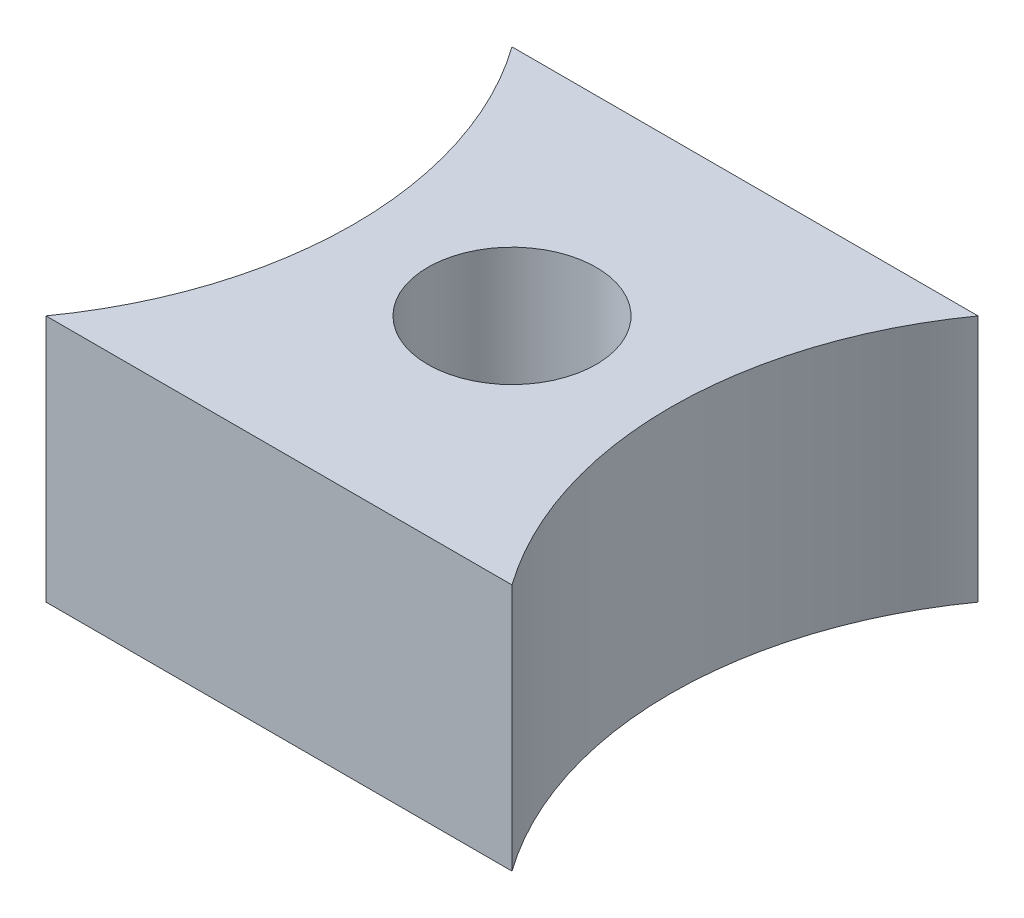
ISO-10303-21;
HEADER;
FILE_DESCRIPTION(('STEP AP214'),'2;1');
FILE_NAME('part.step','',(''),(''),'','','');
FILE_SCHEMA(('AUTOMOTIVE_DESIGN { 1 0 10303 214 1 1 1 1 }'));
ENDSEC;
DATA;
#1=APPLICATION_CONTEXT('core data for automotive mechanical design processes');
#2=APPLICATION_PROTOCOL_DEFINITION('international standard','automotive_design',2000,#1);
#3=PRODUCT_CONTEXT('',#1,'mechanical');
#4=PRODUCT('Part','Part','',(#3));
#5=PRODUCT_RELATED_PRODUCT_CATEGORY('part','',(#4));
#6=PRODUCT_DEFINITION_FORMATION('','',#4);
#7=PRODUCT_DEFINITION_CONTEXT('part definition',#1,'design');
#8=PRODUCT_DEFINITION('design','',#6,#7);
#9=PRODUCT_DEFINITION_SHAPE('','',#8);
#10=(LENGTH_UNIT() NAMED_UNIT(*) SI_UNIT(.MILLI.,.METRE.));
#11=(NAMED_UNIT(*) PLANE_ANGLE_UNIT() SI_UNIT($,.RADIAN.));
#12=(NAMED_UNIT(*) SI_UNIT($,.STERADIAN.) SOLID_ANGLE_UNIT());
#13=UNCERTAINTY_MEASURE_WITH_UNIT(LENGTH_MEASURE(1.E-05),#10,'distance_accuracy_value','');
#14=(GEOMETRIC_REPRESENTATION_CONTEXT(3) GLOBAL_UNCERTAINTY_ASSIGNED_CONTEXT((#13)) GLOBAL_UNIT_ASSIGNED_CONTEXT((#10,
#11,#12)) REPRESENTATION_CONTEXT('',''));
#15=CARTESIAN_POINT('',(0.,0.,0.));
#16=DIRECTION('',(0.,0.,1.));
#17=DIRECTION('',(1.,0.,0.));
#18=AXIS2_PLACEMENT_3D('',#15,#16,#17);
#19=CARTESIAN_POINT('',(14.2962566459461,-6.33,0.));
#20=DIRECTION('',(0.,1.,0.));
#21=DIRECTION('',(0.,0.,1.));
#22=AXIS2_PLACEMENT_3D('',#19,#20,#21);
#23=CYLINDRICAL_SURFACE('',#22,10.25);
#24=CARTESIAN_POINT('',(14.2962566459461,0.,0.));
#25=DIRECTION('',(0.,-1.,0.));
#26=DIRECTION('',(0.,0.,-1.));
#27=AXIS2_PLACEMENT_3D('',#24,#25,#26);
#28=CIRCLE('',#27,10.25);
#29=CARTESIAN_POINT('',(5.95,0.,5.95));
#30=VERTEX_POINT('',#29);
#31=CARTESIAN_POINT('',(5.95,0.,-5.95));
#32=VERTEX_POINT('',#31);
#33=EDGE_CURVE('E108',#30,#32,#28,.T.);
#34=ORIENTED_EDGE('',*,*,#33,.F.);
#35=DIRECTION('',(0.,1.,0.));
#36=VECTOR('',#35,1.);
#37=CARTESIAN_POINT('',(5.95,-6.33,5.95));
#38=LINE('',#37,#36);
#39=CARTESIAN_POINT('',(5.95,-6.33,5.95));
#40=VERTEX_POINT('',#39);
#41=EDGE_CURVE('E11',#40,#30,#38,.T.);
#42=ORIENTED_EDGE('',*,*,#41,.F.);
#43=CARTESIAN_POINT('',(14.2962566459461,-6.33,0.));
#44=DIRECTION('',(0.,-1.,0.));
#45=DIRECTION('',(0.,0.,-1.));
#46=AXIS2_PLACEMENT_3D('',#43,#44,#45);
#47=CIRCLE('',#46,10.25);
#48=CARTESIAN_POINT('',(5.95,-6.33,-5.95));
#49=VERTEX_POINT('',#48);
#50=EDGE_CURVE('E101',#40,#49,#47,.T.);
#51=ORIENTED_EDGE('',*,*,#50,.T.);
#52=DIRECTION('',(0.,1.,0.));
#53=VECTOR('',#52,1.);
#54=CARTESIAN_POINT('',(5.95,-6.33,-5.95));
#55=LINE('',#54,#53);
#56=EDGE_CURVE('E46',#49,#32,#55,.T.);
#57=ORIENTED_EDGE('',*,*,#56,.T.);
#58=EDGE_LOOP('',(#34,#42,#51,#57));
#59=FACE_BOUND('',#58,.T.);
#60=ADVANCED_FACE('F43',(#59),#23,.F.);
#61=CARTESIAN_POINT('',(-5.95,-6.33,5.95));
#62=DIRECTION('',(0.,0.,1.));
#63=DIRECTION('',(1.,0.,0.));
#64=AXIS2_PLACEMENT_3D('',#61,#62,#63);
#65=PLANE('',#64);
#66=DIRECTION('',(1.,0.,0.));
#67=VECTOR('',#66,1.);
#68=CARTESIAN_POINT('',(-5.95,0.,5.95));
#69=LINE('',#68,#67);
#70=CARTESIAN_POINT('',(-5.95,0.,5.95));
#71=VERTEX_POINT('',#70);
#72=EDGE_CURVE('E103',#71,#30,#69,.T.);
#73=ORIENTED_EDGE('',*,*,#72,.F.);
#74=DIRECTION('',(0.,1.,0.));
#75=VECTOR('',#74,1.);
#76=CARTESIAN_POINT('',(-5.95,-6.33,5.95));
#77=LINE('',#76,#75);
#78=CARTESIAN_POINT('',(-5.95,-6.33,5.95));
#79=VERTEX_POINT('',#78);
#80=EDGE_CURVE('E52',#79,#71,#77,.T.);
#81=ORIENTED_EDGE('',*,*,#80,.F.);
#82=DIRECTION('',(1.,0.,0.));
#83=VECTOR('',#82,1.);
#84=CARTESIAN_POINT('',(-5.95,-6.33,5.95));
#85=LINE('',#84,#83);
#86=EDGE_CURVE('E98',#79,#40,#85,.T.);
#87=ORIENTED_EDGE('',*,*,#86,.T.);
#88=ORIENTED_EDGE('',*,*,#41,.T.);
#89=EDGE_LOOP('',(#73,#81,#87,#88));
#90=FACE_BOUND('',#89,.T.);
#91=ADVANCED_FACE('F119',(#90),#65,.T.);
#92=CARTESIAN_POINT('',(-14.2962566459461,-6.33,0.));
#93=DIRECTION('',(0.,1.,0.));
#94=DIRECTION('',(0.,0.,1.));
#95=AXIS2_PLACEMENT_3D('',#92,#93,#94);
#96=CYLINDRICAL_SURFACE('',#95,10.25);
#97=CARTESIAN_POINT('',(-14.2962566459461,0.,0.));
#98=DIRECTION('',(0.,-1.,0.));
#99=DIRECTION('',(0.,0.,1.));
#100=AXIS2_PLACEMENT_3D('',#97,#98,#99);
#101=CIRCLE('',#100,10.25);
#102=CARTESIAN_POINT('',(-5.95,0.,-5.95));
#103=VERTEX_POINT('',#102);
#104=EDGE_CURVE('E93',#103,#71,#101,.T.);
#105=ORIENTED_EDGE('',*,*,#104,.F.);
#106=DIRECTION('',(0.,1.,0.));
#107=VECTOR('',#106,1.);
#108=CARTESIAN_POINT('',(-5.95,-6.33,-5.95));
#109=LINE('',#108,#107);
#110=CARTESIAN_POINT('',(-5.95,-6.33,-5.95));
#111=VERTEX_POINT('',#110);
#112=EDGE_CURVE('E88',#111,#103,#109,.T.);
#113=ORIENTED_EDGE('',*,*,#112,.F.);
#114=CARTESIAN_POINT('',(-14.2962566459461,-6.33,0.));
#115=DIRECTION('',(0.,-1.,0.));
#116=DIRECTION('',(0.,0.,1.));
#117=AXIS2_PLACEMENT_3D('',#114,#115,#116);
#118=CIRCLE('',#117,10.25);
#119=EDGE_CURVE('E91',#111,#79,#118,.T.);
#120=ORIENTED_EDGE('',*,*,#119,.T.);
#121=ORIENTED_EDGE('',*,*,#80,.T.);
#122=EDGE_LOOP('',(#105,#113,#120,#121));
#123=FACE_BOUND('',#122,.T.);
#124=ADVANCED_FACE('F90',(#123),#96,.F.);
#125=CARTESIAN_POINT('',(-5.95,-6.33,-5.95));
#126=DIRECTION('',(0.,0.,-1.));
#127=DIRECTION('',(-1.,0.,0.));
#128=AXIS2_PLACEMENT_3D('',#125,#126,#127);
#129=PLANE('',#128);
#130=DIRECTION('',(-1.,0.,0.));
#131=VECTOR('',#130,1.);
#132=CARTESIAN_POINT('',(-5.95,0.,-5.95));
#133=LINE('',#132,#131);
#134=EDGE_CURVE('E111',#32,#103,#133,.T.);
#135=ORIENTED_EDGE('',*,*,#134,.F.);
#136=ORIENTED_EDGE('',*,*,#56,.F.);
#137=DIRECTION('',(-1.,0.,0.));
#138=VECTOR('',#137,1.);
#139=CARTESIAN_POINT('',(-5.95,-6.33,-5.95));
#140=LINE('',#139,#138);
#141=EDGE_CURVE('E97',#49,#111,#140,.T.);
#142=ORIENTED_EDGE('',*,*,#141,.T.);
#143=ORIENTED_EDGE('',*,*,#112,.T.);
#144=EDGE_LOOP('',(#135,#136,#142,#143));
#145=FACE_BOUND('',#144,.T.);
#146=ADVANCED_FACE('F100',(#145),#129,.T.);
#147=CARTESIAN_POINT('',(14.2962566459461,-6.33,0.));
#148=DIRECTION('',(0.,-1.,0.));
#149=DIRECTION('',(0.,0.,-1.));
#150=AXIS2_PLACEMENT_3D('',#147,#148,#149);
#151=PLANE('',#150);
#152=CARTESIAN_POINT('',(0.,-6.33,0.));
#153=DIRECTION('',(0.,1.,0.));
#154=DIRECTION('',(0.,0.,1.));
#155=AXIS2_PLACEMENT_3D('',#152,#153,#154);
#156=CIRCLE('',#155,2.15);
#157=CARTESIAN_POINT('',(0.,-6.33,2.15));
#158=VERTEX_POINT('',#157);
#159=EDGE_CURVE('E112',#158,#158,#156,.T.);
#160=ORIENTED_EDGE('',*,*,#159,.T.);
#161=EDGE_LOOP('',(#160));
#162=FACE_BOUND('',#161,.T.);
#163=ORIENTED_EDGE('',*,*,#50,.F.);
#164=ORIENTED_EDGE('',*,*,#86,.F.);
#165=ORIENTED_EDGE('',*,*,#119,.F.);
#166=ORIENTED_EDGE('',*,*,#141,.F.);
#167=EDGE_LOOP('',(#163,#164,#165,#166));
#168=FACE_BOUND('',#167,.T.);
#169=ADVANCED_FACE('F96',(#162,#168),#151,.T.);
#170=CARTESIAN_POINT('',(14.2962566459461,0.,0.));
#171=DIRECTION('',(0.,-1.,0.));
#172=DIRECTION('',(0.,0.,-1.));
#173=AXIS2_PLACEMENT_3D('',#170,#171,#172);
#174=PLANE('',#173);
#175=CARTESIAN_POINT('',(0.,0.,0.));
#176=DIRECTION('',(0.,1.,0.));
#177=DIRECTION('',(0.,0.,1.));
#178=AXIS2_PLACEMENT_3D('',#175,#176,#177);
#179=CIRCLE('',#178,2.15);
#180=CARTESIAN_POINT('',(0.,0.,2.15));
#181=VERTEX_POINT('',#180);
#182=EDGE_CURVE('E149',#181,#181,#179,.T.);
#183=ORIENTED_EDGE('',*,*,#182,.F.);
#184=EDGE_LOOP('',(#183));
#185=FACE_BOUND('',#184,.T.);
#186=ORIENTED_EDGE('',*,*,#33,.T.);
#187=ORIENTED_EDGE('',*,*,#134,.T.);
#188=ORIENTED_EDGE('',*,*,#104,.T.);
#189=ORIENTED_EDGE('',*,*,#72,.T.);
#190=EDGE_LOOP('',(#186,#187,#188,#189));
#191=FACE_BOUND('',#190,.T.);
#192=ADVANCED_FACE('F118',(#185,#191),#174,.F.);
#193=CARTESIAN_POINT('',(0.,-6.33,0.));
#194=DIRECTION('',(0.,1.,0.));
#195=DIRECTION('',(0.,0.,1.));
#196=AXIS2_PLACEMENT_3D('',#193,#194,#195);
#197=CYLINDRICAL_SURFACE('',#196,2.15);
#198=ORIENTED_EDGE('',*,*,#159,.F.);
#199=EDGE_LOOP('',(#198));
#200=FACE_BOUND('',#199,.T.);
#201=ORIENTED_EDGE('',*,*,#182,.T.);
#202=EDGE_LOOP('',(#201));
#203=FACE_BOUND('',#202,.T.);
#204=ADVANCED_FACE('F137',(#200,#203),#197,.F.);
#205=CLOSED_SHELL('',(#60,#91,#124,#146,#169,#192,#204));
#206=MANIFOLD_SOLID_BREP('B2',#205);
#207=ADVANCED_BREP_SHAPE_REPRESENTATION('',(#18,#206),#14);
#208=SHAPE_DEFINITION_REPRESENTATION(#9,#207);
ENDSEC;
END-ISO-10303-21;
